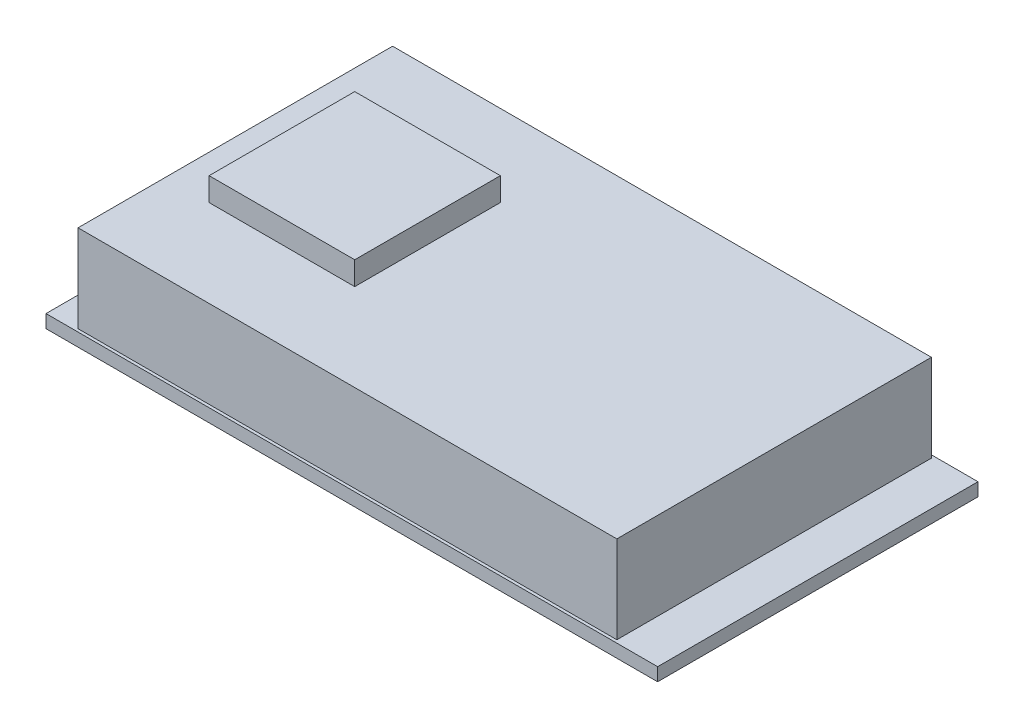
ISO-10303-21;
HEADER;
FILE_DESCRIPTION(('STEP AP214'),'2;1');
FILE_NAME('part.step','',(''),(''),'','','');
FILE_SCHEMA(('AUTOMOTIVE_DESIGN { 1 0 10303 214 1 1 1 1 }'));
ENDSEC;
DATA;
#1=APPLICATION_CONTEXT('core data for automotive mechanical design processes');
#2=APPLICATION_PROTOCOL_DEFINITION('international standard','automotive_design',2000,#1);
#3=PRODUCT_CONTEXT('',#1,'mechanical');
#4=PRODUCT('Part','Part','',(#3));
#5=PRODUCT_RELATED_PRODUCT_CATEGORY('part','',(#4));
#6=PRODUCT_DEFINITION_FORMATION('','',#4);
#7=PRODUCT_DEFINITION_CONTEXT('part definition',#1,'design');
#8=PRODUCT_DEFINITION('design','',#6,#7);
#9=PRODUCT_DEFINITION_SHAPE('','',#8);
#10=(LENGTH_UNIT() NAMED_UNIT(*) SI_UNIT(.MILLI.,.METRE.));
#11=(NAMED_UNIT(*) PLANE_ANGLE_UNIT() SI_UNIT($,.RADIAN.));
#12=(NAMED_UNIT(*) SI_UNIT($,.STERADIAN.) SOLID_ANGLE_UNIT());
#13=UNCERTAINTY_MEASURE_WITH_UNIT(LENGTH_MEASURE(1.E-05),#10,'distance_accuracy_value','');
#14=(GEOMETRIC_REPRESENTATION_CONTEXT(3) GLOBAL_UNCERTAINTY_ASSIGNED_CONTEXT((#13)) GLOBAL_UNIT_ASSIGNED_CONTEXT((#10,
#11,#12)) REPRESENTATION_CONTEXT('',''));
#15=CARTESIAN_POINT('',(0.,0.,0.));
#16=DIRECTION('',(0.,0.,1.));
#17=DIRECTION('',(1.,0.,0.));
#18=AXIS2_PLACEMENT_3D('',#15,#16,#17);
#19=CARTESIAN_POINT('',(0.,34.5,0.));
#20=DIRECTION('',(0.,-1.,0.));
#21=DIRECTION('',(0.,0.,-1.));
#22=AXIS2_PLACEMENT_3D('',#19,#20,#21);
#23=PLANE('',#22);
#24=DIRECTION('',(0.,0.,-1.));
#25=VECTOR('',#24,1.);
#26=CARTESIAN_POINT('',(90.,34.5,-54.));
#27=LINE('',#26,#25);
#28=CARTESIAN_POINT('',(90.,34.5,54.));
#29=VERTEX_POINT('',#28);
#30=CARTESIAN_POINT('',(90.,34.5,-54.));
#31=VERTEX_POINT('',#30);
#32=EDGE_CURVE('E157',#29,#31,#27,.T.);
#33=ORIENTED_EDGE('',*,*,#32,.T.);
#34=DIRECTION('',(-1.,0.,0.));
#35=VECTOR('',#34,1.);
#36=CARTESIAN_POINT('',(90.,34.5,-54.));
#37=LINE('',#36,#35);
#38=CARTESIAN_POINT('',(-95.,34.5,-54.));
#39=VERTEX_POINT('',#38);
#40=EDGE_CURVE('E160',#31,#39,#37,.T.);
#41=ORIENTED_EDGE('',*,*,#40,.T.);
#42=DIRECTION('',(0.,0.,1.));
#43=VECTOR('',#42,1.);
#44=CARTESIAN_POINT('',(-95.,34.5,-54.));
#45=LINE('',#44,#43);
#46=CARTESIAN_POINT('',(-95.,34.5,54.));
#47=VERTEX_POINT('',#46);
#48=EDGE_CURVE('E163',#39,#47,#45,.T.);
#49=ORIENTED_EDGE('',*,*,#48,.T.);
#50=DIRECTION('',(1.,0.,0.));
#51=VECTOR('',#50,1.);
#52=CARTESIAN_POINT('',(90.,34.5,54.));
#53=LINE('',#52,#51);
#54=EDGE_CURVE('E165',#47,#29,#53,.T.);
#55=ORIENTED_EDGE('',*,*,#54,.T.);
#56=EDGE_LOOP('',(#33,#41,#49,#55));
#57=FACE_BOUND('',#56,.T.);
#58=DIRECTION('',(0.,0.,1.));
#59=VECTOR('',#58,1.);
#60=CARTESIAN_POINT('',(-80.,34.5,-26.));
#61=LINE('',#60,#59);
#62=CARTESIAN_POINT('',(-80.,34.5,-26.));
#63=VERTEX_POINT('',#62);
#64=CARTESIAN_POINT('',(-80.,34.5,24.));
#65=VERTEX_POINT('',#64);
#66=EDGE_CURVE('E146',#63,#65,#61,.T.);
#67=ORIENTED_EDGE('',*,*,#66,.F.);
#68=DIRECTION('',(1.,0.,0.));
#69=VECTOR('',#68,1.);
#70=CARTESIAN_POINT('',(-80.,34.5,-26.));
#71=LINE('',#70,#69);
#72=CARTESIAN_POINT('',(-30.,34.5,-26.));
#73=VERTEX_POINT('',#72);
#74=EDGE_CURVE('E142',#63,#73,#71,.T.);
#75=ORIENTED_EDGE('',*,*,#74,.T.);
#76=DIRECTION('',(0.,0.,1.));
#77=VECTOR('',#76,1.);
#78=CARTESIAN_POINT('',(-30.,34.5,-26.));
#79=LINE('',#78,#77);
#80=CARTESIAN_POINT('',(-30.,34.5,24.));
#81=VERTEX_POINT('',#80);
#82=EDGE_CURVE('E48',#73,#81,#79,.T.);
#83=ORIENTED_EDGE('',*,*,#82,.T.);
#84=DIRECTION('',(1.,0.,0.));
#85=VECTOR('',#84,1.);
#86=CARTESIAN_POINT('',(-80.,34.5,24.));
#87=LINE('',#86,#85);
#88=EDGE_CURVE('E368',#65,#81,#87,.T.);
#89=ORIENTED_EDGE('',*,*,#88,.F.);
#90=EDGE_LOOP('',(#67,#75,#83,#89));
#91=FACE_BOUND('',#90,.T.);
#92=ADVANCED_FACE('F33',(#57,#91),#23,.F.);
#93=CARTESIAN_POINT('',(0.,4.5,0.));
#94=DIRECTION('',(0.,1.,0.));
#95=DIRECTION('',(0.,0.,1.));
#96=AXIS2_PLACEMENT_3D('',#93,#94,#95);
#97=PLANE('',#96);
#98=DIRECTION('',(0.,0.,-1.));
#99=VECTOR('',#98,1.);
#100=CARTESIAN_POINT('',(105.,4.5,-55.));
#101=LINE('',#100,#99);
#102=CARTESIAN_POINT('',(105.,4.5,55.));
#103=VERTEX_POINT('',#102);
#104=CARTESIAN_POINT('',(105.,4.5,-55.));
#105=VERTEX_POINT('',#104);
#106=EDGE_CURVE('E181',#103,#105,#101,.T.);
#107=ORIENTED_EDGE('',*,*,#106,.T.);
#108=DIRECTION('',(-1.,0.,0.));
#109=VECTOR('',#108,1.);
#110=CARTESIAN_POINT('',(-105.,4.5,-55.));
#111=LINE('',#110,#109);
#112=CARTESIAN_POINT('',(-105.,4.5,-55.));
#113=VERTEX_POINT('',#112);
#114=EDGE_CURVE('E184',#105,#113,#111,.T.);
#115=ORIENTED_EDGE('',*,*,#114,.T.);
#116=DIRECTION('',(0.,0.,1.));
#117=VECTOR('',#116,1.);
#118=CARTESIAN_POINT('',(-105.,4.5,-55.));
#119=LINE('',#118,#117);
#120=CARTESIAN_POINT('',(-105.,4.5,55.));
#121=VERTEX_POINT('',#120);
#122=EDGE_CURVE('E187',#113,#121,#119,.T.);
#123=ORIENTED_EDGE('',*,*,#122,.T.);
#124=DIRECTION('',(1.,0.,0.));
#125=VECTOR('',#124,1.);
#126=CARTESIAN_POINT('',(-105.,4.5,55.));
#127=LINE('',#126,#125);
#128=EDGE_CURVE('E189',#121,#103,#127,.T.);
#129=ORIENTED_EDGE('',*,*,#128,.T.);
#130=EDGE_LOOP('',(#107,#115,#123,#129));
#131=FACE_BOUND('',#130,.T.);
#132=DIRECTION('',(-1.,0.,0.));
#133=VECTOR('',#132,1.);
#134=CARTESIAN_POINT('',(90.,4.5,-54.));
#135=LINE('',#134,#133);
#136=CARTESIAN_POINT('',(90.,4.5,-54.));
#137=VERTEX_POINT('',#136);
#138=CARTESIAN_POINT('',(-95.,4.5,-54.));
#139=VERTEX_POINT('',#138);
#140=EDGE_CURVE('E151',#137,#139,#135,.T.);
#141=ORIENTED_EDGE('',*,*,#140,.F.);
#142=DIRECTION('',(0.,0.,-1.));
#143=VECTOR('',#142,1.);
#144=CARTESIAN_POINT('',(90.,4.5,-54.));
#145=LINE('',#144,#143);
#146=CARTESIAN_POINT('',(90.,4.5,54.));
#147=VERTEX_POINT('',#146);
#148=EDGE_CURVE('E148',#147,#137,#145,.T.);
#149=ORIENTED_EDGE('',*,*,#148,.F.);
#150=DIRECTION('',(1.,0.,0.));
#151=VECTOR('',#150,1.);
#152=CARTESIAN_POINT('',(90.,4.5,54.));
#153=LINE('',#152,#151);
#154=CARTESIAN_POINT('',(-95.,4.5,54.));
#155=VERTEX_POINT('',#154);
#156=EDGE_CURVE('E161',#155,#147,#153,.T.);
#157=ORIENTED_EDGE('',*,*,#156,.F.);
#158=DIRECTION('',(0.,0.,1.));
#159=VECTOR('',#158,1.);
#160=CARTESIAN_POINT('',(-95.,4.5,-54.));
#161=LINE('',#160,#159);
#162=EDGE_CURVE('E169',#139,#155,#161,.T.);
#163=ORIENTED_EDGE('',*,*,#162,.F.);
#164=EDGE_LOOP('',(#141,#149,#157,#163));
#165=FACE_BOUND('',#164,.T.);
#166=ADVANCED_FACE('F223',(#131,#165),#97,.T.);
#167=CARTESIAN_POINT('',(105.,4.5,-55.));
#168=DIRECTION('',(-1.,0.,0.));
#169=DIRECTION('',(0.,0.,1.));
#170=AXIS2_PLACEMENT_3D('',#167,#168,#169);
#171=PLANE('',#170);
#172=DIRECTION('',(0.,0.,-1.));
#173=VECTOR('',#172,1.);
#174=CARTESIAN_POINT('',(105.,0.,-55.));
#175=LINE('',#174,#173);
#176=CARTESIAN_POINT('',(105.,0.,55.));
#177=VERTEX_POINT('',#176);
#178=CARTESIAN_POINT('',(105.,0.,-55.));
#179=VERTEX_POINT('',#178);
#180=EDGE_CURVE('E180',#177,#179,#175,.T.);
#181=ORIENTED_EDGE('',*,*,#180,.T.);
#182=DIRECTION('',(0.,-1.,0.));
#183=VECTOR('',#182,1.);
#184=CARTESIAN_POINT('',(105.,4.5,-55.));
#185=LINE('',#184,#183);
#186=EDGE_CURVE('E11',#105,#179,#185,.T.);
#187=ORIENTED_EDGE('',*,*,#186,.F.);
#188=ORIENTED_EDGE('',*,*,#106,.F.);
#189=DIRECTION('',(0.,-1.,0.));
#190=VECTOR('',#189,1.);
#191=CARTESIAN_POINT('',(105.,4.5,55.));
#192=LINE('',#191,#190);
#193=EDGE_CURVE('E191',#103,#177,#192,.T.);
#194=ORIENTED_EDGE('',*,*,#193,.T.);
#195=EDGE_LOOP('',(#181,#187,#188,#194));
#196=FACE_BOUND('',#195,.T.);
#197=ADVANCED_FACE('F35',(#196),#171,.F.);
#198=CARTESIAN_POINT('',(-105.,4.5,-55.));
#199=DIRECTION('',(0.,0.,1.));
#200=DIRECTION('',(1.,0.,0.));
#201=AXIS2_PLACEMENT_3D('',#198,#199,#200);
#202=PLANE('',#201);
#203=DIRECTION('',(-1.,0.,0.));
#204=VECTOR('',#203,1.);
#205=CARTESIAN_POINT('',(-105.,0.,-55.));
#206=LINE('',#205,#204);
#207=CARTESIAN_POINT('',(-105.,0.,-55.));
#208=VERTEX_POINT('',#207);
#209=EDGE_CURVE('E194',#179,#208,#206,.T.);
#210=ORIENTED_EDGE('',*,*,#209,.T.);
#211=DIRECTION('',(0.,-1.,0.));
#212=VECTOR('',#211,1.);
#213=CARTESIAN_POINT('',(-105.,4.5,-55.));
#214=LINE('',#213,#212);
#215=EDGE_CURVE('E41',#113,#208,#214,.T.);
#216=ORIENTED_EDGE('',*,*,#215,.F.);
#217=ORIENTED_EDGE('',*,*,#114,.F.);
#218=ORIENTED_EDGE('',*,*,#186,.T.);
#219=EDGE_LOOP('',(#210,#216,#217,#218));
#220=FACE_BOUND('',#219,.T.);
#221=ADVANCED_FACE('F225',(#220),#202,.F.);
#222=CARTESIAN_POINT('',(-105.,4.5,-55.));
#223=DIRECTION('',(1.,0.,0.));
#224=DIRECTION('',(0.,0.,-1.));
#225=AXIS2_PLACEMENT_3D('',#222,#223,#224);
#226=PLANE('',#225);
#227=DIRECTION('',(0.,0.,1.));
#228=VECTOR('',#227,1.);
#229=CARTESIAN_POINT('',(-105.,0.,-55.));
#230=LINE('',#229,#228);
#231=CARTESIAN_POINT('',(-105.,0.,55.));
#232=VERTEX_POINT('',#231);
#233=EDGE_CURVE('E196',#208,#232,#230,.T.);
#234=ORIENTED_EDGE('',*,*,#233,.T.);
#235=DIRECTION('',(0.,-1.,0.));
#236=VECTOR('',#235,1.);
#237=CARTESIAN_POINT('',(-105.,4.5,55.));
#238=LINE('',#237,#236);
#239=EDGE_CURVE('E201',#121,#232,#238,.T.);
#240=ORIENTED_EDGE('',*,*,#239,.F.);
#241=ORIENTED_EDGE('',*,*,#122,.F.);
#242=ORIENTED_EDGE('',*,*,#215,.T.);
#243=EDGE_LOOP('',(#234,#240,#241,#242));
#244=FACE_BOUND('',#243,.T.);
#245=ADVANCED_FACE('F208',(#244),#226,.F.);
#246=CARTESIAN_POINT('',(-105.,4.5,55.));
#247=DIRECTION('',(0.,0.,-1.));
#248=DIRECTION('',(-1.,0.,0.));
#249=AXIS2_PLACEMENT_3D('',#246,#247,#248);
#250=PLANE('',#249);
#251=DIRECTION('',(1.,0.,0.));
#252=VECTOR('',#251,1.);
#253=CARTESIAN_POINT('',(-105.,0.,55.));
#254=LINE('',#253,#252);
#255=EDGE_CURVE('E185',#232,#177,#254,.T.);
#256=ORIENTED_EDGE('',*,*,#255,.T.);
#257=ORIENTED_EDGE('',*,*,#193,.F.);
#258=ORIENTED_EDGE('',*,*,#128,.F.);
#259=ORIENTED_EDGE('',*,*,#239,.T.);
#260=EDGE_LOOP('',(#256,#257,#258,#259));
#261=FACE_BOUND('',#260,.T.);
#262=ADVANCED_FACE('F217',(#261),#250,.F.);
#263=CARTESIAN_POINT('',(0.,0.,0.));
#264=DIRECTION('',(0.,1.,0.));
#265=DIRECTION('',(0.,0.,1.));
#266=AXIS2_PLACEMENT_3D('',#263,#264,#265);
#267=PLANE('',#266);
#268=ORIENTED_EDGE('',*,*,#180,.F.);
#269=ORIENTED_EDGE('',*,*,#255,.F.);
#270=ORIENTED_EDGE('',*,*,#233,.F.);
#271=ORIENTED_EDGE('',*,*,#209,.F.);
#272=EDGE_LOOP('',(#268,#269,#270,#271));
#273=FACE_BOUND('',#272,.T.);
#274=ADVANCED_FACE('F214',(#273),#267,.F.);
#275=CARTESIAN_POINT('',(90.,34.5,-54.));
#276=DIRECTION('',(-1.,0.,0.));
#277=DIRECTION('',(0.,0.,1.));
#278=AXIS2_PLACEMENT_3D('',#275,#276,#277);
#279=PLANE('',#278);
#280=ORIENTED_EDGE('',*,*,#148,.T.);
#281=DIRECTION('',(0.,-1.,0.));
#282=VECTOR('',#281,1.);
#283=CARTESIAN_POINT('',(90.,34.5,-54.));
#284=LINE('',#283,#282);
#285=EDGE_CURVE('E178',#31,#137,#284,.T.);
#286=ORIENTED_EDGE('',*,*,#285,.F.);
#287=ORIENTED_EDGE('',*,*,#32,.F.);
#288=DIRECTION('',(0.,-1.,0.));
#289=VECTOR('',#288,1.);
#290=CARTESIAN_POINT('',(90.,34.5,54.));
#291=LINE('',#290,#289);
#292=EDGE_CURVE('E166',#29,#147,#291,.T.);
#293=ORIENTED_EDGE('',*,*,#292,.T.);
#294=EDGE_LOOP('',(#280,#286,#287,#293));
#295=FACE_BOUND('',#294,.T.);
#296=ADVANCED_FACE('F253',(#295),#279,.F.);
#297=CARTESIAN_POINT('',(90.,34.5,-54.));
#298=DIRECTION('',(0.,0.,1.));
#299=DIRECTION('',(1.,0.,0.));
#300=AXIS2_PLACEMENT_3D('',#297,#298,#299);
#301=PLANE('',#300);
#302=ORIENTED_EDGE('',*,*,#140,.T.);
#303=DIRECTION('',(0.,-1.,0.));
#304=VECTOR('',#303,1.);
#305=CARTESIAN_POINT('',(-95.,34.5,-54.));
#306=LINE('',#305,#304);
#307=EDGE_CURVE('E175',#39,#139,#306,.T.);
#308=ORIENTED_EDGE('',*,*,#307,.F.);
#309=ORIENTED_EDGE('',*,*,#40,.F.);
#310=ORIENTED_EDGE('',*,*,#285,.T.);
#311=EDGE_LOOP('',(#302,#308,#309,#310));
#312=FACE_BOUND('',#311,.T.);
#313=ADVANCED_FACE('F249',(#312),#301,.F.);
#314=CARTESIAN_POINT('',(-95.,34.5,-54.));
#315=DIRECTION('',(1.,0.,0.));
#316=DIRECTION('',(0.,0.,-1.));
#317=AXIS2_PLACEMENT_3D('',#314,#315,#316);
#318=PLANE('',#317);
#319=ORIENTED_EDGE('',*,*,#162,.T.);
#320=DIRECTION('',(0.,-1.,0.));
#321=VECTOR('',#320,1.);
#322=CARTESIAN_POINT('',(-95.,34.5,54.));
#323=LINE('',#322,#321);
#324=EDGE_CURVE('E56',#47,#155,#323,.T.);
#325=ORIENTED_EDGE('',*,*,#324,.F.);
#326=ORIENTED_EDGE('',*,*,#48,.F.);
#327=ORIENTED_EDGE('',*,*,#307,.T.);
#328=EDGE_LOOP('',(#319,#325,#326,#327));
#329=FACE_BOUND('',#328,.T.);
#330=ADVANCED_FACE('F246',(#329),#318,.F.);
#331=CARTESIAN_POINT('',(90.,34.5,54.));
#332=DIRECTION('',(0.,0.,-1.));
#333=DIRECTION('',(-1.,0.,0.));
#334=AXIS2_PLACEMENT_3D('',#331,#332,#333);
#335=PLANE('',#334);
#336=ORIENTED_EDGE('',*,*,#156,.T.);
#337=ORIENTED_EDGE('',*,*,#292,.F.);
#338=ORIENTED_EDGE('',*,*,#54,.F.);
#339=ORIENTED_EDGE('',*,*,#324,.T.);
#340=EDGE_LOOP('',(#336,#337,#338,#339));
#341=FACE_BOUND('',#340,.T.);
#342=ADVANCED_FACE('F243',(#341),#335,.F.);
#343=CARTESIAN_POINT('',(-80.,42.5,-26.));
#344=DIRECTION('',(1.,0.,0.));
#345=DIRECTION('',(0.,0.,-1.));
#346=AXIS2_PLACEMENT_3D('',#343,#344,#345);
#347=PLANE('',#346);
#348=ORIENTED_EDGE('',*,*,#66,.T.);
#349=DIRECTION('',(0.,-1.,0.));
#350=VECTOR('',#349,1.);
#351=CARTESIAN_POINT('',(-80.,42.5,24.));
#352=LINE('',#351,#350);
#353=CARTESIAN_POINT('',(-80.,42.5,24.));
#354=VERTEX_POINT('',#353);
#355=EDGE_CURVE('E127',#354,#65,#352,.T.);
#356=ORIENTED_EDGE('',*,*,#355,.F.);
#357=DIRECTION('',(0.,0.,1.));
#358=VECTOR('',#357,1.);
#359=CARTESIAN_POINT('',(-80.,42.5,-26.));
#360=LINE('',#359,#358);
#361=CARTESIAN_POINT('',(-80.,42.5,-26.));
#362=VERTEX_POINT('',#361);
#363=EDGE_CURVE('E134',#362,#354,#360,.T.);
#364=ORIENTED_EDGE('',*,*,#363,.F.);
#365=DIRECTION('',(0.,-1.,0.));
#366=VECTOR('',#365,1.);
#367=CARTESIAN_POINT('',(-80.,42.5,-26.));
#368=LINE('',#367,#366);
#369=EDGE_CURVE('E366',#362,#63,#368,.T.);
#370=ORIENTED_EDGE('',*,*,#369,.T.);
#371=EDGE_LOOP('',(#348,#356,#364,#370));
#372=FACE_BOUND('',#371,.T.);
#373=ADVANCED_FACE('F144',(#372),#347,.F.);
#374=CARTESIAN_POINT('',(-80.,42.5,24.));
#375=DIRECTION('',(0.,0.,-1.));
#376=DIRECTION('',(-1.,0.,0.));
#377=AXIS2_PLACEMENT_3D('',#374,#375,#376);
#378=PLANE('',#377);
#379=ORIENTED_EDGE('',*,*,#88,.T.);
#380=DIRECTION('',(0.,-1.,0.));
#381=VECTOR('',#380,1.);
#382=CARTESIAN_POINT('',(-30.,42.5,24.));
#383=LINE('',#382,#381);
#384=CARTESIAN_POINT('',(-30.,42.5,24.));
#385=VERTEX_POINT('',#384);
#386=EDGE_CURVE('E129',#385,#81,#383,.T.);
#387=ORIENTED_EDGE('',*,*,#386,.F.);
#388=DIRECTION('',(1.,0.,0.));
#389=VECTOR('',#388,1.);
#390=CARTESIAN_POINT('',(-80.,42.5,24.));
#391=LINE('',#390,#389);
#392=EDGE_CURVE('E122',#354,#385,#391,.T.);
#393=ORIENTED_EDGE('',*,*,#392,.F.);
#394=ORIENTED_EDGE('',*,*,#355,.T.);
#395=EDGE_LOOP('',(#379,#387,#393,#394));
#396=FACE_BOUND('',#395,.T.);
#397=ADVANCED_FACE('F125',(#396),#378,.F.);
#398=CARTESIAN_POINT('',(-30.,42.5,-26.));
#399=DIRECTION('',(1.,0.,0.));
#400=DIRECTION('',(0.,0.,-1.));
#401=AXIS2_PLACEMENT_3D('',#398,#399,#400);
#402=PLANE('',#401);
#403=ORIENTED_EDGE('',*,*,#82,.F.);
#404=DIRECTION('',(0.,-1.,0.));
#405=VECTOR('',#404,1.);
#406=CARTESIAN_POINT('',(-30.,42.5,-26.));
#407=LINE('',#406,#405);
#408=CARTESIAN_POINT('',(-30.,42.5,-26.));
#409=VERTEX_POINT('',#408);
#410=EDGE_CURVE('E153',#409,#73,#407,.T.);
#411=ORIENTED_EDGE('',*,*,#410,.F.);
#412=DIRECTION('',(0.,0.,1.));
#413=VECTOR('',#412,1.);
#414=CARTESIAN_POINT('',(-30.,42.5,-26.));
#415=LINE('',#414,#413);
#416=EDGE_CURVE('E133',#409,#385,#415,.T.);
#417=ORIENTED_EDGE('',*,*,#416,.T.);
#418=ORIENTED_EDGE('',*,*,#386,.T.);
#419=EDGE_LOOP('',(#403,#411,#417,#418));
#420=FACE_BOUND('',#419,.T.);
#421=ADVANCED_FACE('F297',(#420),#402,.T.);
#422=CARTESIAN_POINT('',(-80.,42.5,-26.));
#423=DIRECTION('',(0.,0.,-1.));
#424=DIRECTION('',(-1.,0.,0.));
#425=AXIS2_PLACEMENT_3D('',#422,#423,#424);
#426=PLANE('',#425);
#427=ORIENTED_EDGE('',*,*,#74,.F.);
#428=ORIENTED_EDGE('',*,*,#369,.F.);
#429=DIRECTION('',(1.,0.,0.));
#430=VECTOR('',#429,1.);
#431=CARTESIAN_POINT('',(-80.,42.5,-26.));
#432=LINE('',#431,#430);
#433=EDGE_CURVE('E140',#362,#409,#432,.T.);
#434=ORIENTED_EDGE('',*,*,#433,.T.);
#435=ORIENTED_EDGE('',*,*,#410,.T.);
#436=EDGE_LOOP('',(#427,#428,#434,#435));
#437=FACE_BOUND('',#436,.T.);
#438=ADVANCED_FACE('F303',(#437),#426,.T.);
#439=CARTESIAN_POINT('',(0.,42.5,0.));
#440=DIRECTION('',(0.,1.,0.));
#441=DIRECTION('',(0.,0.,1.));
#442=AXIS2_PLACEMENT_3D('',#439,#440,#441);
#443=PLANE('',#442);
#444=ORIENTED_EDGE('',*,*,#363,.T.);
#445=ORIENTED_EDGE('',*,*,#392,.T.);
#446=ORIENTED_EDGE('',*,*,#416,.F.);
#447=ORIENTED_EDGE('',*,*,#433,.F.);
#448=EDGE_LOOP('',(#444,#445,#446,#447));
#449=FACE_BOUND('',#448,.T.);
#450=ADVANCED_FACE('F138',(#449),#443,.T.);
#451=CLOSED_SHELL('',(#92,#166,#197,#221,#245,#262,#274,#296,#313,#330,#342,#373,#397,#421,#438,#450));
#452=MANIFOLD_SOLID_BREP('B2',#451);
#453=ADVANCED_BREP_SHAPE_REPRESENTATION('',(#18,#452),#14);
#454=SHAPE_DEFINITION_REPRESENTATION(#9,#453);
ENDSEC;
END-ISO-10303-21;
